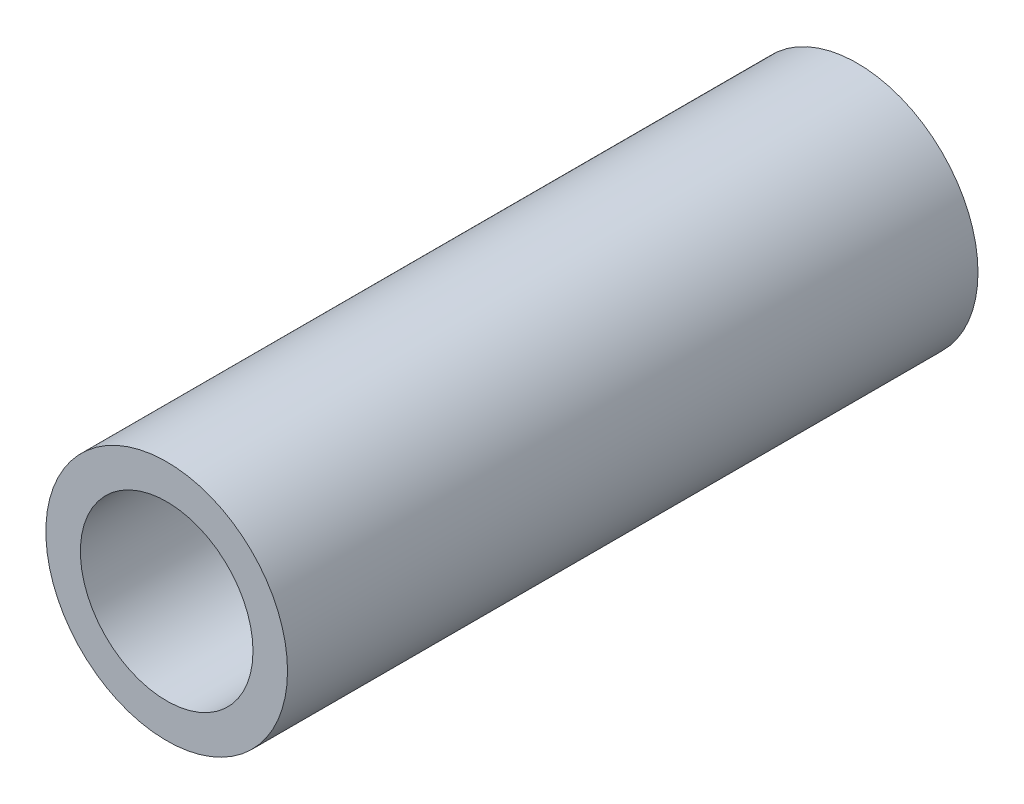
ISO-10303-21;
HEADER;
FILE_DESCRIPTION(('STEP AP214'),'2;1');
FILE_NAME('part.step','',(''),(''),'','','');
FILE_SCHEMA(('AUTOMOTIVE_DESIGN { 1 0 10303 214 1 1 1 1 }'));
ENDSEC;
DATA;
#1=APPLICATION_CONTEXT('core data for automotive mechanical design processes');
#2=APPLICATION_PROTOCOL_DEFINITION('international standard','automotive_design',2000,#1);
#3=PRODUCT_CONTEXT('',#1,'mechanical');
#4=PRODUCT('Part','Part','',(#3));
#5=PRODUCT_RELATED_PRODUCT_CATEGORY('part','',(#4));
#6=PRODUCT_DEFINITION_FORMATION('','',#4);
#7=PRODUCT_DEFINITION_CONTEXT('part definition',#1,'design');
#8=PRODUCT_DEFINITION('design','',#6,#7);
#9=PRODUCT_DEFINITION_SHAPE('','',#8);
#10=(LENGTH_UNIT() NAMED_UNIT(*) SI_UNIT(.MILLI.,.METRE.));
#11=(NAMED_UNIT(*) PLANE_ANGLE_UNIT() SI_UNIT($,.RADIAN.));
#12=(NAMED_UNIT(*) SI_UNIT($,.STERADIAN.) SOLID_ANGLE_UNIT());
#13=UNCERTAINTY_MEASURE_WITH_UNIT(LENGTH_MEASURE(1.E-05),#10,'distance_accuracy_value','');
#14=(GEOMETRIC_REPRESENTATION_CONTEXT(3) GLOBAL_UNCERTAINTY_ASSIGNED_CONTEXT((#13)) GLOBAL_UNIT_ASSIGNED_CONTEXT((#10,
#11,#12)) REPRESENTATION_CONTEXT('',''));
#15=CARTESIAN_POINT('',(0.,0.,0.));
#16=DIRECTION('',(0.,0.,1.));
#17=DIRECTION('',(1.,0.,0.));
#18=AXIS2_PLACEMENT_3D('',#15,#16,#17);
#19=CARTESIAN_POINT('',(0.,0.,200.));
#20=DIRECTION('',(0.,0.,1.));
#21=DIRECTION('',(1.,0.,0.));
#22=AXIS2_PLACEMENT_3D('',#19,#20,#21);
#23=PLANE('',#22);
#24=CARTESIAN_POINT('',(0.,0.,200.));
#25=DIRECTION('',(0.,0.,1.));
#26=DIRECTION('',(1.,0.,0.));
#27=AXIS2_PLACEMENT_3D('',#24,#25,#26);
#28=CIRCLE('',#27,35.);
#29=CARTESIAN_POINT('',(35.,0.,200.));
#30=VERTEX_POINT('',#29);
#31=EDGE_CURVE('E10',#30,#30,#28,.T.);
#32=ORIENTED_EDGE('',*,*,#31,.T.);
#33=EDGE_LOOP('',(#32));
#34=FACE_BOUND('',#33,.T.);
#35=CARTESIAN_POINT('',(0.,0.,200.));
#36=DIRECTION('',(0.,0.,1.));
#37=DIRECTION('',(1.,0.,0.));
#38=AXIS2_PLACEMENT_3D('',#35,#36,#37);
#39=CIRCLE('',#38,25.);
#40=CARTESIAN_POINT('',(25.,0.,200.));
#41=VERTEX_POINT('',#40);
#42=EDGE_CURVE('E43',#41,#41,#39,.T.);
#43=ORIENTED_EDGE('',*,*,#42,.F.);
#44=EDGE_LOOP('',(#43));
#45=FACE_BOUND('',#44,.T.);
#46=ADVANCED_FACE('F32',(#34,#45),#23,.T.);
#47=CARTESIAN_POINT('',(0.,0.,0.));
#48=DIRECTION('',(0.,0.,1.));
#49=DIRECTION('',(1.,0.,0.));
#50=AXIS2_PLACEMENT_3D('',#47,#48,#49);
#51=PLANE('',#50);
#52=CARTESIAN_POINT('',(0.,0.,0.));
#53=DIRECTION('',(0.,0.,1.));
#54=DIRECTION('',(1.,0.,0.));
#55=AXIS2_PLACEMENT_3D('',#52,#53,#54);
#56=CIRCLE('',#55,35.);
#57=CARTESIAN_POINT('',(35.,0.,0.));
#58=VERTEX_POINT('',#57);
#59=EDGE_CURVE('E36',#58,#58,#56,.T.);
#60=ORIENTED_EDGE('',*,*,#59,.F.);
#61=EDGE_LOOP('',(#60));
#62=FACE_BOUND('',#61,.T.);
#63=CARTESIAN_POINT('',(0.,0.,0.));
#64=DIRECTION('',(0.,0.,1.));
#65=DIRECTION('',(1.,0.,0.));
#66=AXIS2_PLACEMENT_3D('',#63,#64,#65);
#67=CIRCLE('',#66,25.);
#68=CARTESIAN_POINT('',(25.,0.,0.));
#69=VERTEX_POINT('',#68);
#70=EDGE_CURVE('E45',#69,#69,#67,.T.);
#71=ORIENTED_EDGE('',*,*,#70,.T.);
#72=EDGE_LOOP('',(#71));
#73=FACE_BOUND('',#72,.T.);
#74=ADVANCED_FACE('F55',(#62,#73),#51,.F.);
#75=CARTESIAN_POINT('',(0.,0.,200.));
#76=DIRECTION('',(0.,0.,-1.));
#77=DIRECTION('',(-1.,0.,0.));
#78=AXIS2_PLACEMENT_3D('',#75,#76,#77);
#79=CYLINDRICAL_SURFACE('',#78,35.);
#80=ORIENTED_EDGE('',*,*,#31,.F.);
#81=EDGE_LOOP('',(#80));
#82=FACE_BOUND('',#81,.T.);
#83=ORIENTED_EDGE('',*,*,#59,.T.);
#84=EDGE_LOOP('',(#83));
#85=FACE_BOUND('',#84,.T.);
#86=ADVANCED_FACE('F34',(#82,#85),#79,.T.);
#87=CARTESIAN_POINT('',(0.,0.,200.));
#88=DIRECTION('',(0.,0.,-1.));
#89=DIRECTION('',(-1.,0.,0.));
#90=AXIS2_PLACEMENT_3D('',#87,#88,#89);
#91=CYLINDRICAL_SURFACE('',#90,25.);
#92=ORIENTED_EDGE('',*,*,#42,.T.);
#93=EDGE_LOOP('',(#92));
#94=FACE_BOUND('',#93,.T.);
#95=ORIENTED_EDGE('',*,*,#70,.F.);
#96=EDGE_LOOP('',(#95));
#97=FACE_BOUND('',#96,.T.);
#98=ADVANCED_FACE('F51',(#94,#97),#91,.F.);
#99=CLOSED_SHELL('',(#46,#74,#86,#98));
#100=MANIFOLD_SOLID_BREP('B2',#99);
#101=ADVANCED_BREP_SHAPE_REPRESENTATION('',(#18,#100),#14);
#102=SHAPE_DEFINITION_REPRESENTATION(#9,#101);
ENDSEC;
END-ISO-10303-21;
